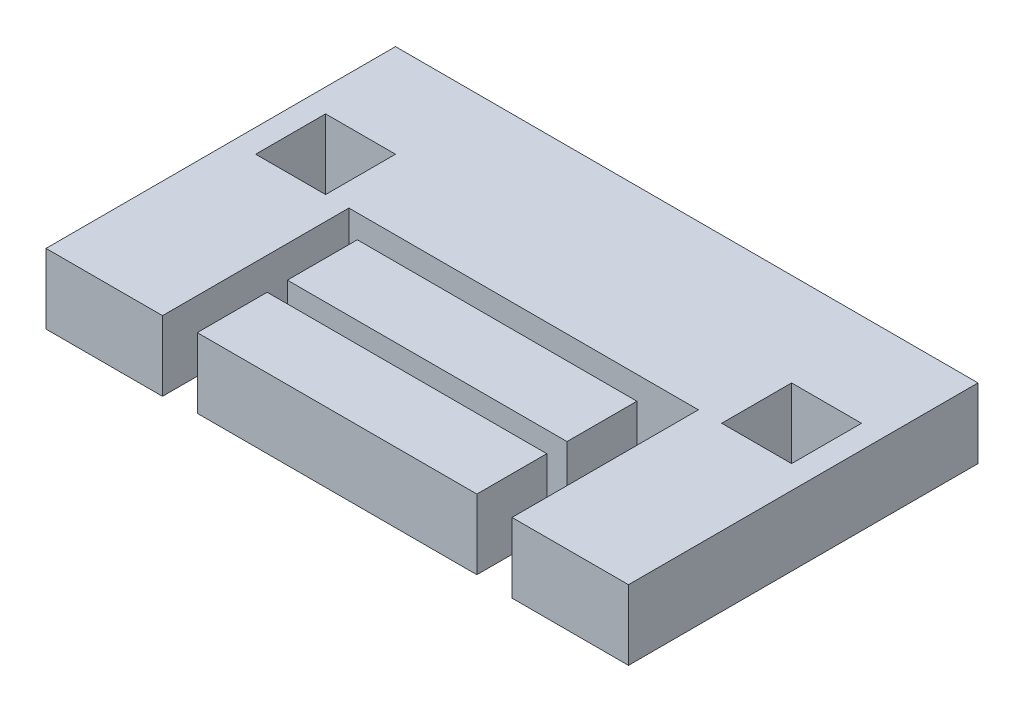
ISO-10303-21;
HEADER;
FILE_DESCRIPTION(('STEP AP214'),'2;1');
FILE_NAME('part.step','',(''),(''),'','','');
FILE_SCHEMA(('AUTOMOTIVE_DESIGN { 1 0 10303 214 1 1 1 1 }'));
ENDSEC;
DATA;
#1=APPLICATION_CONTEXT('core data for automotive mechanical design processes');
#2=APPLICATION_PROTOCOL_DEFINITION('international standard','automotive_design',2000,#1);
#3=PRODUCT_CONTEXT('',#1,'mechanical');
#4=PRODUCT('Part','Part','',(#3));
#5=PRODUCT_RELATED_PRODUCT_CATEGORY('part','',(#4));
#6=PRODUCT_DEFINITION_FORMATION('','',#4);
#7=PRODUCT_DEFINITION_CONTEXT('part definition',#1,'design');
#8=PRODUCT_DEFINITION('design','',#6,#7);
#9=PRODUCT_DEFINITION_SHAPE('','',#8);
#10=(LENGTH_UNIT() NAMED_UNIT(*) SI_UNIT(.MILLI.,.METRE.));
#11=(NAMED_UNIT(*) PLANE_ANGLE_UNIT() SI_UNIT($,.RADIAN.));
#12=(NAMED_UNIT(*) SI_UNIT($,.STERADIAN.) SOLID_ANGLE_UNIT());
#13=UNCERTAINTY_MEASURE_WITH_UNIT(LENGTH_MEASURE(1.E-05),#10,'distance_accuracy_value','');
#14=(GEOMETRIC_REPRESENTATION_CONTEXT(3) GLOBAL_UNCERTAINTY_ASSIGNED_CONTEXT((#13)) GLOBAL_UNIT_ASSIGNED_CONTEXT((#10,
#11,#12)) REPRESENTATION_CONTEXT('',''));
#15=CARTESIAN_POINT('',(0.,0.,0.));
#16=DIRECTION('',(0.,0.,1.));
#17=DIRECTION('',(1.,0.,0.));
#18=AXIS2_PLACEMENT_3D('',#15,#16,#17);
#19=CARTESIAN_POINT('',(-0.427005904587279,3.,0.));
#20=DIRECTION('',(1.,0.,0.));
#21=DIRECTION('',(0.,0.,-1.));
#22=AXIS2_PLACEMENT_3D('',#19,#20,#21);
#23=PLANE('',#22);
#24=DIRECTION('',(0.,0.,1.));
#25=VECTOR('',#24,1.);
#26=CARTESIAN_POINT('',(-0.427005904587279,0.,0.));
#27=LINE('',#26,#25);
#28=CARTESIAN_POINT('',(-0.427005904587279,0.,-7.70715429925636));
#29=VERTEX_POINT('',#28);
#30=CARTESIAN_POINT('',(-0.427005904587279,0.,-4.70715429925636));
#31=VERTEX_POINT('',#30);
#32=EDGE_CURVE('E182',#29,#31,#27,.T.);
#33=ORIENTED_EDGE('',*,*,#32,.F.);
#34=DIRECTION('',(0.,-1.,0.));
#35=VECTOR('',#34,1.);
#36=CARTESIAN_POINT('',(-0.427005904587279,3.,-7.70715429925636));
#37=LINE('',#36,#35);
#38=CARTESIAN_POINT('',(-0.427005904587279,3.,-7.70715429925636));
#39=VERTEX_POINT('',#38);
#40=EDGE_CURVE('E13',#39,#29,#37,.T.);
#41=ORIENTED_EDGE('',*,*,#40,.F.);
#42=DIRECTION('',(0.,0.,1.));
#43=VECTOR('',#42,1.);
#44=CARTESIAN_POINT('',(-0.427005904587279,3.,0.));
#45=LINE('',#44,#43);
#46=CARTESIAN_POINT('',(-0.427005904587279,3.,-4.70715429925636));
#47=VERTEX_POINT('',#46);
#48=EDGE_CURVE('E176',#39,#47,#45,.T.);
#49=ORIENTED_EDGE('',*,*,#48,.T.);
#50=DIRECTION('',(0.,-1.,0.));
#51=VECTOR('',#50,1.);
#52=CARTESIAN_POINT('',(-0.427005904587279,3.,-4.70715429925636));
#53=LINE('',#52,#51);
#54=EDGE_CURVE('E157',#47,#31,#53,.T.);
#55=ORIENTED_EDGE('',*,*,#54,.T.);
#56=EDGE_LOOP('',(#33,#41,#49,#55));
#57=FACE_BOUND('',#56,.T.);
#58=ADVANCED_FACE('F119',(#57),#23,.T.);
#59=CARTESIAN_POINT('',(0.,3.,-7.70715429925636));
#60=DIRECTION('',(0.,0.,-1.));
#61=DIRECTION('',(-1.,0.,0.));
#62=AXIS2_PLACEMENT_3D('',#59,#60,#61);
#63=PLANE('',#62);
#64=DIRECTION('',(1.,0.,0.));
#65=VECTOR('',#64,1.);
#66=CARTESIAN_POINT('',(0.,0.,-7.70715429925636));
#67=LINE('',#66,#65);
#68=CARTESIAN_POINT('',(-12.4270059045873,0.,-7.70715429925636));
#69=VERTEX_POINT('',#68);
#70=EDGE_CURVE('E170',#69,#29,#67,.T.);
#71=ORIENTED_EDGE('',*,*,#70,.F.);
#72=DIRECTION('',(0.,-1.,0.));
#73=VECTOR('',#72,1.);
#74=CARTESIAN_POINT('',(-12.4270059045873,3.,-7.70715429925636));
#75=LINE('',#74,#73);
#76=CARTESIAN_POINT('',(-12.4270059045873,3.,-7.70715429925636));
#77=VERTEX_POINT('',#76);
#78=EDGE_CURVE('E127',#77,#69,#75,.T.);
#79=ORIENTED_EDGE('',*,*,#78,.F.);
#80=DIRECTION('',(1.,0.,0.));
#81=VECTOR('',#80,1.);
#82=CARTESIAN_POINT('',(0.,3.,-7.70715429925636));
#83=LINE('',#82,#81);
#84=EDGE_CURVE('E168',#77,#39,#83,.T.);
#85=ORIENTED_EDGE('',*,*,#84,.T.);
#86=ORIENTED_EDGE('',*,*,#40,.T.);
#87=EDGE_LOOP('',(#71,#79,#85,#86));
#88=FACE_BOUND('',#87,.T.);
#89=ADVANCED_FACE('F166',(#88),#63,.T.);
#90=CARTESIAN_POINT('',(-12.4270059045873,3.,0.));
#91=DIRECTION('',(1.,0.,0.));
#92=DIRECTION('',(0.,0.,-1.));
#93=AXIS2_PLACEMENT_3D('',#90,#91,#92);
#94=PLANE('',#93);
#95=DIRECTION('',(0.,0.,1.));
#96=VECTOR('',#95,1.);
#97=CARTESIAN_POINT('',(-12.4270059045873,0.,0.));
#98=LINE('',#97,#96);
#99=CARTESIAN_POINT('',(-12.4270059045873,0.,-4.70715429925636));
#100=VERTEX_POINT('',#99);
#101=EDGE_CURVE('E150',#69,#100,#98,.T.);
#102=ORIENTED_EDGE('',*,*,#101,.T.);
#103=DIRECTION('',(0.,-1.,0.));
#104=VECTOR('',#103,1.);
#105=CARTESIAN_POINT('',(-12.4270059045873,3.,-4.70715429925636));
#106=LINE('',#105,#104);
#107=CARTESIAN_POINT('',(-12.4270059045873,3.,-4.70715429925636));
#108=VERTEX_POINT('',#107);
#109=EDGE_CURVE('E171',#108,#100,#106,.T.);
#110=ORIENTED_EDGE('',*,*,#109,.F.);
#111=DIRECTION('',(0.,0.,1.));
#112=VECTOR('',#111,1.);
#113=CARTESIAN_POINT('',(-12.4270059045873,3.,0.));
#114=LINE('',#113,#112);
#115=EDGE_CURVE('E172',#77,#108,#114,.T.);
#116=ORIENTED_EDGE('',*,*,#115,.F.);
#117=ORIENTED_EDGE('',*,*,#78,.T.);
#118=EDGE_LOOP('',(#102,#110,#116,#117));
#119=FACE_BOUND('',#118,.T.);
#120=ADVANCED_FACE('F173',(#119),#94,.F.);
#121=CARTESIAN_POINT('',(0.,3.,-4.70715429925636));
#122=DIRECTION('',(0.,0.,-1.));
#123=DIRECTION('',(-1.,0.,0.));
#124=AXIS2_PLACEMENT_3D('',#121,#122,#123);
#125=PLANE('',#124);
#126=DIRECTION('',(1.,0.,0.));
#127=VECTOR('',#126,1.);
#128=CARTESIAN_POINT('',(0.,0.,-4.70715429925636));
#129=LINE('',#128,#127);
#130=EDGE_CURVE('E178',#100,#31,#129,.T.);
#131=ORIENTED_EDGE('',*,*,#130,.T.);
#132=ORIENTED_EDGE('',*,*,#54,.F.);
#133=DIRECTION('',(1.,0.,0.));
#134=VECTOR('',#133,1.);
#135=CARTESIAN_POINT('',(0.,3.,-4.70715429925636));
#136=LINE('',#135,#134);
#137=EDGE_CURVE('E135',#108,#47,#136,.T.);
#138=ORIENTED_EDGE('',*,*,#137,.F.);
#139=ORIENTED_EDGE('',*,*,#109,.T.);
#140=EDGE_LOOP('',(#131,#132,#138,#139));
#141=FACE_BOUND('',#140,.T.);
#142=ADVANCED_FACE('F191',(#141),#125,.F.);
#143=CARTESIAN_POINT('',(0.,3.,0.));
#144=DIRECTION('',(0.,1.,0.));
#145=DIRECTION('',(0.,0.,1.));
#146=AXIS2_PLACEMENT_3D('',#143,#144,#145);
#147=PLANE('',#146);
#148=ORIENTED_EDGE('',*,*,#48,.F.);
#149=ORIENTED_EDGE('',*,*,#84,.F.);
#150=ORIENTED_EDGE('',*,*,#115,.T.);
#151=ORIENTED_EDGE('',*,*,#137,.T.);
#152=EDGE_LOOP('',(#148,#149,#150,#151));
#153=FACE_BOUND('',#152,.T.);
#154=ADVANCED_FACE('F175',(#153),#147,.T.);
#155=CARTESIAN_POINT('',(0.,0.,0.));
#156=DIRECTION('',(0.,1.,0.));
#157=DIRECTION('',(0.,0.,1.));
#158=AXIS2_PLACEMENT_3D('',#155,#156,#157);
#159=PLANE('',#158);
#160=ORIENTED_EDGE('',*,*,#32,.T.);
#161=ORIENTED_EDGE('',*,*,#130,.F.);
#162=ORIENTED_EDGE('',*,*,#101,.F.);
#163=ORIENTED_EDGE('',*,*,#70,.T.);
#164=EDGE_LOOP('',(#160,#161,#162,#163));
#165=FACE_BOUND('',#164,.T.);
#166=ADVANCED_FACE('F193',(#165),#159,.F.);
#167=CLOSED_SHELL('',(#58,#89,#120,#142,#154,#166));
#168=MANIFOLD_SOLID_BREP('B2',#167);
#169=CARTESIAN_POINT('',(-0.443434317864046,3.,0.));
#170=DIRECTION('',(1.,0.,0.));
#171=DIRECTION('',(0.,0.,-1.));
#172=AXIS2_PLACEMENT_3D('',#169,#170,#171);
#173=PLANE('',#172);
#174=DIRECTION('',(0.,0.,1.));
#175=VECTOR('',#174,1.);
#176=CARTESIAN_POINT('',(-0.443434317864046,0.,0.));
#177=LINE('',#176,#175);
#178=CARTESIAN_POINT('',(-0.443434317864047,0.,-11.5917753515357));
#179=VERTEX_POINT('',#178);
#180=CARTESIAN_POINT('',(-0.443434317864047,0.,-8.59177535153571));
#181=VERTEX_POINT('',#180);
#182=EDGE_CURVE('E314',#179,#181,#177,.T.);
#183=ORIENTED_EDGE('',*,*,#182,.F.);
#184=DIRECTION('',(0.,-1.,0.));
#185=VECTOR('',#184,1.);
#186=CARTESIAN_POINT('',(-0.443434317864047,3.,-11.5917753515357));
#187=LINE('',#186,#185);
#188=CARTESIAN_POINT('',(-0.443434317864047,3.,-11.5917753515357));
#189=VERTEX_POINT('',#188);
#190=EDGE_CURVE('E117',#189,#179,#187,.T.);
#191=ORIENTED_EDGE('',*,*,#190,.F.);
#192=DIRECTION('',(0.,0.,1.));
#193=VECTOR('',#192,1.);
#194=CARTESIAN_POINT('',(-0.443434317864046,3.,0.));
#195=LINE('',#194,#193);
#196=CARTESIAN_POINT('',(-0.443434317864047,3.,-8.59177535153571));
#197=VERTEX_POINT('',#196);
#198=EDGE_CURVE('E308',#189,#197,#195,.T.);
#199=ORIENTED_EDGE('',*,*,#198,.T.);
#200=DIRECTION('',(0.,-1.,0.));
#201=VECTOR('',#200,1.);
#202=CARTESIAN_POINT('',(-0.443434317864047,3.,-8.59177535153571));
#203=LINE('',#202,#201);
#204=EDGE_CURVE('E289',#197,#181,#203,.T.);
#205=ORIENTED_EDGE('',*,*,#204,.T.);
#206=EDGE_LOOP('',(#183,#191,#199,#205));
#207=FACE_BOUND('',#206,.T.);
#208=ADVANCED_FACE('F251',(#207),#173,.T.);
#209=CARTESIAN_POINT('',(0.,3.,-11.5917753515357));
#210=DIRECTION('',(0.,0.,-1.));
#211=DIRECTION('',(-1.,0.,0.));
#212=AXIS2_PLACEMENT_3D('',#209,#210,#211);
#213=PLANE('',#212);
#214=DIRECTION('',(1.,0.,0.));
#215=VECTOR('',#214,1.);
#216=CARTESIAN_POINT('',(0.,0.,-11.5917753515357));
#217=LINE('',#216,#215);
#218=CARTESIAN_POINT('',(-12.443434317864,0.,-11.5917753515357));
#219=VERTEX_POINT('',#218);
#220=EDGE_CURVE('E302',#219,#179,#217,.T.);
#221=ORIENTED_EDGE('',*,*,#220,.F.);
#222=DIRECTION('',(0.,-1.,0.));
#223=VECTOR('',#222,1.);
#224=CARTESIAN_POINT('',(-12.443434317864,3.,-11.5917753515357));
#225=LINE('',#224,#223);
#226=CARTESIAN_POINT('',(-12.443434317864,3.,-11.5917753515357));
#227=VERTEX_POINT('',#226);
#228=EDGE_CURVE('E259',#227,#219,#225,.T.);
#229=ORIENTED_EDGE('',*,*,#228,.F.);
#230=DIRECTION('',(1.,0.,0.));
#231=VECTOR('',#230,1.);
#232=CARTESIAN_POINT('',(0.,3.,-11.5917753515357));
#233=LINE('',#232,#231);
#234=EDGE_CURVE('E300',#227,#189,#233,.T.);
#235=ORIENTED_EDGE('',*,*,#234,.T.);
#236=ORIENTED_EDGE('',*,*,#190,.T.);
#237=EDGE_LOOP('',(#221,#229,#235,#236));
#238=FACE_BOUND('',#237,.T.);
#239=ADVANCED_FACE('F298',(#238),#213,.T.);
#240=CARTESIAN_POINT('',(-12.443434317864,3.,0.));
#241=DIRECTION('',(1.,0.,0.));
#242=DIRECTION('',(0.,0.,-1.));
#243=AXIS2_PLACEMENT_3D('',#240,#241,#242);
#244=PLANE('',#243);
#245=DIRECTION('',(0.,0.,1.));
#246=VECTOR('',#245,1.);
#247=CARTESIAN_POINT('',(-12.443434317864,0.,0.));
#248=LINE('',#247,#246);
#249=CARTESIAN_POINT('',(-12.443434317864,0.,-8.59177535153571));
#250=VERTEX_POINT('',#249);
#251=EDGE_CURVE('E282',#219,#250,#248,.T.);
#252=ORIENTED_EDGE('',*,*,#251,.T.);
#253=DIRECTION('',(0.,-1.,0.));
#254=VECTOR('',#253,1.);
#255=CARTESIAN_POINT('',(-12.443434317864,3.,-8.59177535153571));
#256=LINE('',#255,#254);
#257=CARTESIAN_POINT('',(-12.443434317864,3.,-8.59177535153571));
#258=VERTEX_POINT('',#257);
#259=EDGE_CURVE('E303',#258,#250,#256,.T.);
#260=ORIENTED_EDGE('',*,*,#259,.F.);
#261=DIRECTION('',(0.,0.,1.));
#262=VECTOR('',#261,1.);
#263=CARTESIAN_POINT('',(-12.443434317864,3.,0.));
#264=LINE('',#263,#262);
#265=EDGE_CURVE('E304',#227,#258,#264,.T.);
#266=ORIENTED_EDGE('',*,*,#265,.F.);
#267=ORIENTED_EDGE('',*,*,#228,.T.);
#268=EDGE_LOOP('',(#252,#260,#266,#267));
#269=FACE_BOUND('',#268,.T.);
#270=ADVANCED_FACE('F305',(#269),#244,.F.);
#271=CARTESIAN_POINT('',(0.,3.,-8.59177535153571));
#272=DIRECTION('',(0.,0.,-1.));
#273=DIRECTION('',(-1.,0.,0.));
#274=AXIS2_PLACEMENT_3D('',#271,#272,#273);
#275=PLANE('',#274);
#276=DIRECTION('',(1.,0.,0.));
#277=VECTOR('',#276,1.);
#278=CARTESIAN_POINT('',(0.,0.,-8.59177535153571));
#279=LINE('',#278,#277);
#280=EDGE_CURVE('E310',#250,#181,#279,.T.);
#281=ORIENTED_EDGE('',*,*,#280,.T.);
#282=ORIENTED_EDGE('',*,*,#204,.F.);
#283=DIRECTION('',(1.,0.,0.));
#284=VECTOR('',#283,1.);
#285=CARTESIAN_POINT('',(0.,3.,-8.59177535153571));
#286=LINE('',#285,#284);
#287=EDGE_CURVE('E267',#258,#197,#286,.T.);
#288=ORIENTED_EDGE('',*,*,#287,.F.);
#289=ORIENTED_EDGE('',*,*,#259,.T.);
#290=EDGE_LOOP('',(#281,#282,#288,#289));
#291=FACE_BOUND('',#290,.T.);
#292=ADVANCED_FACE('F323',(#291),#275,.F.);
#293=CARTESIAN_POINT('',(0.,3.,0.));
#294=DIRECTION('',(0.,1.,0.));
#295=DIRECTION('',(0.,0.,1.));
#296=AXIS2_PLACEMENT_3D('',#293,#294,#295);
#297=PLANE('',#296);
#298=ORIENTED_EDGE('',*,*,#198,.F.);
#299=ORIENTED_EDGE('',*,*,#234,.F.);
#300=ORIENTED_EDGE('',*,*,#265,.T.);
#301=ORIENTED_EDGE('',*,*,#287,.T.);
#302=EDGE_LOOP('',(#298,#299,#300,#301));
#303=FACE_BOUND('',#302,.T.);
#304=ADVANCED_FACE('F307',(#303),#297,.T.);
#305=CARTESIAN_POINT('',(0.,0.,0.));
#306=DIRECTION('',(0.,1.,0.));
#307=DIRECTION('',(0.,0.,1.));
#308=AXIS2_PLACEMENT_3D('',#305,#306,#307);
#309=PLANE('',#308);
#310=ORIENTED_EDGE('',*,*,#182,.T.);
#311=ORIENTED_EDGE('',*,*,#280,.F.);
#312=ORIENTED_EDGE('',*,*,#251,.F.);
#313=ORIENTED_EDGE('',*,*,#220,.T.);
#314=EDGE_LOOP('',(#310,#311,#312,#313));
#315=FACE_BOUND('',#314,.T.);
#316=ADVANCED_FACE('F325',(#315),#309,.F.);
#317=CLOSED_SHELL('',(#208,#239,#270,#292,#304,#316));
#318=MANIFOLD_SOLID_BREP('B7',#317);
#319=CARTESIAN_POINT('',(0.,3.,-15.5917753515357));
#320=DIRECTION('',(0.,0.,1.));
#321=DIRECTION('',(1.,0.,0.));
#322=AXIS2_PLACEMENT_3D('',#319,#320,#321);
#323=PLANE('',#322);
#324=DIRECTION('',(-1.,0.,0.));
#325=VECTOR('',#324,1.);
#326=CARTESIAN_POINT('',(0.,0.,-15.5917753515357));
#327=LINE('',#326,#325);
#328=CARTESIAN_POINT('',(5.19620285318212,0.,-15.5917753515357));
#329=VERTEX_POINT('',#328);
#330=CARTESIAN_POINT('',(2.19620285318211,0.,-15.5917753515357));
#331=VERTEX_POINT('',#330);
#332=EDGE_CURVE('E588',#329,#331,#327,.T.);
#333=ORIENTED_EDGE('',*,*,#332,.F.);
#334=DIRECTION('',(0.,-1.,0.));
#335=VECTOR('',#334,1.);
#336=CARTESIAN_POINT('',(5.19620285318212,3.,-15.5917753515357));
#337=LINE('',#336,#335);
#338=CARTESIAN_POINT('',(5.19620285318212,3.,-15.5917753515357));
#339=VERTEX_POINT('',#338);
#340=EDGE_CURVE('E249',#339,#329,#337,.T.);
#341=ORIENTED_EDGE('',*,*,#340,.F.);
#342=DIRECTION('',(-1.,0.,0.));
#343=VECTOR('',#342,1.);
#344=CARTESIAN_POINT('',(0.,3.,-15.5917753515357));
#345=LINE('',#344,#343);
#346=CARTESIAN_POINT('',(2.19620285318211,3.,-15.5917753515357));
#347=VERTEX_POINT('',#346);
#348=EDGE_CURVE('E508',#339,#347,#345,.T.);
#349=ORIENTED_EDGE('',*,*,#348,.T.);
#350=DIRECTION('',(0.,-1.,0.));
#351=VECTOR('',#350,1.);
#352=CARTESIAN_POINT('',(2.19620285318211,3.,-15.5917753515357));
#353=LINE('',#352,#351);
#354=EDGE_CURVE('E393',#347,#331,#353,.T.);
#355=ORIENTED_EDGE('',*,*,#354,.T.);
#356=EDGE_LOOP('',(#333,#341,#349,#355));
#357=FACE_BOUND('',#356,.T.);
#358=ADVANCED_FACE('F374',(#357),#323,.T.);
#359=CARTESIAN_POINT('',(5.1962028531821,3.,0.));
#360=DIRECTION('',(1.,0.,0.));
#361=DIRECTION('',(0.,0.,-1.));
#362=AXIS2_PLACEMENT_3D('',#359,#360,#361);
#363=PLANE('',#362);
#364=DIRECTION('',(0.,0.,1.));
#365=VECTOR('',#364,1.);
#366=CARTESIAN_POINT('',(5.1962028531821,0.,0.));
#367=LINE('',#366,#365);
#368=CARTESIAN_POINT('',(5.19620285318211,0.,-12.5917753515357));
#369=VERTEX_POINT('',#368);
#370=EDGE_CURVE('E513',#329,#369,#367,.T.);
#371=ORIENTED_EDGE('',*,*,#370,.T.);
#372=DIRECTION('',(0.,-1.,0.));
#373=VECTOR('',#372,1.);
#374=CARTESIAN_POINT('',(5.19620285318211,3.,-12.5917753515357));
#375=LINE('',#374,#373);
#376=CARTESIAN_POINT('',(5.19620285318211,3.,-12.5917753515357));
#377=VERTEX_POINT('',#376);
#378=EDGE_CURVE('E384',#377,#369,#375,.T.);
#379=ORIENTED_EDGE('',*,*,#378,.F.);
#380=DIRECTION('',(0.,0.,1.));
#381=VECTOR('',#380,1.);
#382=CARTESIAN_POINT('',(5.1962028531821,3.,0.));
#383=LINE('',#382,#381);
#384=EDGE_CURVE('E503',#339,#377,#383,.T.);
#385=ORIENTED_EDGE('',*,*,#384,.F.);
#386=ORIENTED_EDGE('',*,*,#340,.T.);
#387=EDGE_LOOP('',(#371,#379,#385,#386));
#388=FACE_BOUND('',#387,.T.);
#389=ADVANCED_FACE('F511',(#388),#363,.F.);
#390=CARTESIAN_POINT('',(0.,3.,-12.5917753515357));
#391=DIRECTION('',(0.,0.,1.));
#392=DIRECTION('',(1.,0.,0.));
#393=AXIS2_PLACEMENT_3D('',#390,#391,#392);
#394=PLANE('',#393);
#395=DIRECTION('',(-1.,0.,0.));
#396=VECTOR('',#395,1.);
#397=CARTESIAN_POINT('',(0.,0.,-12.5917753515357));
#398=LINE('',#397,#396);
#399=CARTESIAN_POINT('',(2.19620285318211,0.,-12.5917753515357));
#400=VERTEX_POINT('',#399);
#401=EDGE_CURVE('E591',#369,#400,#398,.T.);
#402=ORIENTED_EDGE('',*,*,#401,.T.);
#403=DIRECTION('',(0.,-1.,0.));
#404=VECTOR('',#403,1.);
#405=CARTESIAN_POINT('',(2.19620285318211,3.,-12.5917753515357));
#406=LINE('',#405,#404);
#407=CARTESIAN_POINT('',(2.19620285318211,3.,-12.5917753515357));
#408=VERTEX_POINT('',#407);
#409=EDGE_CURVE('E443',#408,#400,#406,.T.);
#410=ORIENTED_EDGE('',*,*,#409,.F.);
#411=DIRECTION('',(-1.,0.,0.));
#412=VECTOR('',#411,1.);
#413=CARTESIAN_POINT('',(0.,3.,-12.5917753515357));
#414=LINE('',#413,#412);
#415=EDGE_CURVE('E495',#377,#408,#414,.T.);
#416=ORIENTED_EDGE('',*,*,#415,.F.);
#417=ORIENTED_EDGE('',*,*,#378,.T.);
#418=EDGE_LOOP('',(#402,#410,#416,#417));
#419=FACE_BOUND('',#418,.T.);
#420=ADVANCED_FACE('F497',(#419),#394,.F.);
#421=CARTESIAN_POINT('',(0.,3.,-15.5917753515357));
#422=DIRECTION('',(0.,0.,-1.));
#423=DIRECTION('',(-1.,0.,0.));
#424=AXIS2_PLACEMENT_3D('',#421,#422,#423);
#425=PLANE('',#424);
#426=DIRECTION('',(1.,0.,0.));
#427=VECTOR('',#426,1.);
#428=CARTESIAN_POINT('',(0.,0.,-15.5917753515357));
#429=LINE('',#428,#427);
#430=CARTESIAN_POINT('',(-17.8037971468179,0.,-15.5917753515357));
#431=VERTEX_POINT('',#430);
#432=CARTESIAN_POINT('',(-14.8037971468179,0.,-15.5917753515357));
#433=VERTEX_POINT('',#432);
#434=EDGE_CURVE('E576',#431,#433,#429,.T.);
#435=ORIENTED_EDGE('',*,*,#434,.T.);
#436=DIRECTION('',(0.,-1.,0.));
#437=VECTOR('',#436,1.);
#438=CARTESIAN_POINT('',(-14.8037971468179,3.,-15.5917753515357));
#439=LINE('',#438,#437);
#440=CARTESIAN_POINT('',(-14.8037971468179,3.,-15.5917753515357));
#441=VERTEX_POINT('',#440);
#442=EDGE_CURVE('E524',#441,#433,#439,.T.);
#443=ORIENTED_EDGE('',*,*,#442,.F.);
#444=DIRECTION('',(1.,0.,0.));
#445=VECTOR('',#444,1.);
#446=CARTESIAN_POINT('',(0.,3.,-15.5917753515357));
#447=LINE('',#446,#445);
#448=CARTESIAN_POINT('',(-17.8037971468179,3.,-15.5917753515357));
#449=VERTEX_POINT('',#448);
#450=EDGE_CURVE('E614',#449,#441,#447,.T.);
#451=ORIENTED_EDGE('',*,*,#450,.F.);
#452=DIRECTION('',(0.,-1.,0.));
#453=VECTOR('',#452,1.);
#454=CARTESIAN_POINT('',(-17.8037971468179,3.,-15.5917753515357));
#455=LINE('',#454,#453);
#456=EDGE_CURVE('E518',#449,#431,#455,.T.);
#457=ORIENTED_EDGE('',*,*,#456,.T.);
#458=EDGE_LOOP('',(#435,#443,#451,#457));
#459=FACE_BOUND('',#458,.T.);
#460=ADVANCED_FACE('F658',(#459),#425,.F.);
#461=CARTESIAN_POINT('',(-14.8037971468179,3.,0.));
#462=DIRECTION('',(1.,0.,0.));
#463=DIRECTION('',(0.,0.,-1.));
#464=AXIS2_PLACEMENT_3D('',#461,#462,#463);
#465=PLANE('',#464);
#466=DIRECTION('',(0.,0.,1.));
#467=VECTOR('',#466,1.);
#468=CARTESIAN_POINT('',(-14.8037971468179,0.,0.));
#469=LINE('',#468,#467);
#470=CARTESIAN_POINT('',(-14.8037971468179,0.,-12.5917753515357));
#471=VERTEX_POINT('',#470);
#472=EDGE_CURVE('E579',#433,#471,#469,.T.);
#473=ORIENTED_EDGE('',*,*,#472,.T.);
#474=DIRECTION('',(0.,-1.,0.));
#475=VECTOR('',#474,1.);
#476=CARTESIAN_POINT('',(-14.8037971468179,3.,-12.5917753515357));
#477=LINE('',#476,#475);
#478=CARTESIAN_POINT('',(-14.8037971468179,3.,-12.5917753515357));
#479=VERTEX_POINT('',#478);
#480=EDGE_CURVE('E522',#479,#471,#477,.T.);
#481=ORIENTED_EDGE('',*,*,#480,.F.);
#482=DIRECTION('',(0.,0.,1.));
#483=VECTOR('',#482,1.);
#484=CARTESIAN_POINT('',(-14.8037971468179,3.,0.));
#485=LINE('',#484,#483);
#486=EDGE_CURVE('E617',#441,#479,#485,.T.);
#487=ORIENTED_EDGE('',*,*,#486,.F.);
#488=ORIENTED_EDGE('',*,*,#442,.T.);
#489=EDGE_LOOP('',(#473,#481,#487,#488));
#490=FACE_BOUND('',#489,.T.);
#491=ADVANCED_FACE('F654',(#490),#465,.F.);
#492=CARTESIAN_POINT('',(0.,3.,-12.5917753515357));
#493=DIRECTION('',(0.,0.,-1.));
#494=DIRECTION('',(-1.,0.,0.));
#495=AXIS2_PLACEMENT_3D('',#492,#493,#494);
#496=PLANE('',#495);
#497=DIRECTION('',(1.,0.,0.));
#498=VECTOR('',#497,1.);
#499=CARTESIAN_POINT('',(0.,0.,-12.5917753515357));
#500=LINE('',#499,#498);
#501=CARTESIAN_POINT('',(-17.8037971468179,0.,-12.5917753515357));
#502=VERTEX_POINT('',#501);
#503=EDGE_CURVE('E582',#502,#471,#500,.T.);
#504=ORIENTED_EDGE('',*,*,#503,.F.);
#505=DIRECTION('',(0.,-1.,0.));
#506=VECTOR('',#505,1.);
#507=CARTESIAN_POINT('',(-17.8037971468179,3.,-12.5917753515357));
#508=LINE('',#507,#506);
#509=CARTESIAN_POINT('',(-17.8037971468179,3.,-12.5917753515357));
#510=VERTEX_POINT('',#509);
#511=EDGE_CURVE('E520',#510,#502,#508,.T.);
#512=ORIENTED_EDGE('',*,*,#511,.F.);
#513=DIRECTION('',(1.,0.,0.));
#514=VECTOR('',#513,1.);
#515=CARTESIAN_POINT('',(0.,3.,-12.5917753515357));
#516=LINE('',#515,#514);
#517=EDGE_CURVE('E619',#510,#479,#516,.T.);
#518=ORIENTED_EDGE('',*,*,#517,.T.);
#519=ORIENTED_EDGE('',*,*,#480,.T.);
#520=EDGE_LOOP('',(#504,#512,#518,#519));
#521=FACE_BOUND('',#520,.T.);
#522=ADVANCED_FACE('F651',(#521),#496,.T.);
#523=CARTESIAN_POINT('',(0.,3.,-12.5917753515357));
#524=DIRECTION('',(0.,0.,-1.));
#525=DIRECTION('',(-1.,0.,0.));
#526=AXIS2_PLACEMENT_3D('',#523,#524,#525);
#527=PLANE('',#526);
#528=DIRECTION('',(1.,0.,0.));
#529=VECTOR('',#528,1.);
#530=CARTESIAN_POINT('',(0.,0.,-12.5917753515357));
#531=LINE('',#530,#529);
#532=CARTESIAN_POINT('',(-13.8037971468179,0.,-12.5917753515357));
#533=VERTEX_POINT('',#532);
#534=CARTESIAN_POINT('',(1.19620285318211,0.,-12.5917753515357));
#535=VERTEX_POINT('',#534);
#536=EDGE_CURVE('E554',#533,#535,#531,.T.);
#537=ORIENTED_EDGE('',*,*,#536,.T.);
#538=DIRECTION('',(0.,-1.,0.));
#539=VECTOR('',#538,1.);
#540=CARTESIAN_POINT('',(1.19620285318211,3.,-12.5917753515357));
#541=LINE('',#540,#539);
#542=CARTESIAN_POINT('',(1.19620285318211,3.,-12.5917753515357));
#543=VERTEX_POINT('',#542);
#544=EDGE_CURVE('E378',#543,#535,#541,.T.);
#545=ORIENTED_EDGE('',*,*,#544,.F.);
#546=DIRECTION('',(1.,0.,0.));
#547=VECTOR('',#546,1.);
#548=CARTESIAN_POINT('',(0.,3.,-12.5917753515357));
#549=LINE('',#548,#547);
#550=CARTESIAN_POINT('',(-13.8037971468179,3.,-12.5917753515357));
#551=VERTEX_POINT('',#550);
#552=EDGE_CURVE('E595',#551,#543,#549,.T.);
#553=ORIENTED_EDGE('',*,*,#552,.F.);
#554=DIRECTION('',(0.,-1.,0.));
#555=VECTOR('',#554,1.);
#556=CARTESIAN_POINT('',(-13.8037971468179,3.,-12.5917753515357));
#557=LINE('',#556,#555);
#558=EDGE_CURVE('E527',#551,#533,#557,.T.);
#559=ORIENTED_EDGE('',*,*,#558,.T.);
#560=EDGE_LOOP('',(#537,#545,#553,#559));
#561=FACE_BOUND('',#560,.T.);
#562=ADVANCED_FACE('F376',(#561),#527,.F.);
#563=CARTESIAN_POINT('',(1.19620285318212,3.,0.));
#564=DIRECTION('',(1.,0.,0.));
#565=DIRECTION('',(0.,0.,-1.));
#566=AXIS2_PLACEMENT_3D('',#563,#564,#565);
#567=PLANE('',#566);
#568=DIRECTION('',(0.,0.,1.));
#569=VECTOR('',#568,1.);
#570=CARTESIAN_POINT('',(1.19620285318212,0.,0.));
#571=LINE('',#570,#569);
#572=CARTESIAN_POINT('',(1.19620285318212,0.,-4.59177535153571));
#573=VERTEX_POINT('',#572);
#574=EDGE_CURVE('E550',#535,#573,#571,.T.);
#575=ORIENTED_EDGE('',*,*,#574,.T.);
#576=DIRECTION('',(0.,-1.,0.));
#577=VECTOR('',#576,1.);
#578=CARTESIAN_POINT('',(1.19620285318212,3.,-4.59177535153571));
#579=LINE('',#578,#577);
#580=CARTESIAN_POINT('',(1.19620285318212,3.,-4.59177535153571));
#581=VERTEX_POINT('',#580);
#582=EDGE_CURVE('E542',#581,#573,#579,.T.);
#583=ORIENTED_EDGE('',*,*,#582,.F.);
#584=DIRECTION('',(0.,0.,1.));
#585=VECTOR('',#584,1.);
#586=CARTESIAN_POINT('',(1.19620285318212,3.,0.));
#587=LINE('',#586,#585);
#588=EDGE_CURVE('E456',#543,#581,#587,.T.);
#589=ORIENTED_EDGE('',*,*,#588,.F.);
#590=ORIENTED_EDGE('',*,*,#544,.T.);
#591=EDGE_LOOP('',(#575,#583,#589,#590));
#592=FACE_BOUND('',#591,.T.);
#593=ADVANCED_FACE('F549',(#592),#567,.F.);
#594=CARTESIAN_POINT('',(0.,3.,-4.59177535153571));
#595=DIRECTION('',(0.,0.,-1.));
#596=DIRECTION('',(-1.,0.,0.));
#597=AXIS2_PLACEMENT_3D('',#594,#595,#596);
#598=PLANE('',#597);
#599=DIRECTION('',(1.,0.,0.));
#600=VECTOR('',#599,1.);
#601=CARTESIAN_POINT('',(0.,0.,-4.59177535153571));
#602=LINE('',#601,#600);
#603=CARTESIAN_POINT('',(6.19620285318211,0.,-4.59177535153571));
#604=VERTEX_POINT('',#603);
#605=EDGE_CURVE('E559',#573,#604,#602,.T.);
#606=ORIENTED_EDGE('',*,*,#605,.T.);
#607=DIRECTION('',(0.,-1.,0.));
#608=VECTOR('',#607,1.);
#609=CARTESIAN_POINT('',(6.19620285318211,3.,-4.59177535153571));
#610=LINE('',#609,#608);
#611=CARTESIAN_POINT('',(6.19620285318211,3.,-4.59177535153571));
#612=VERTEX_POINT('',#611);
#613=EDGE_CURVE('E540',#612,#604,#610,.T.);
#614=ORIENTED_EDGE('',*,*,#613,.F.);
#615=DIRECTION('',(1.,0.,0.));
#616=VECTOR('',#615,1.);
#617=CARTESIAN_POINT('',(0.,3.,-4.59177535153571));
#618=LINE('',#617,#616);
#619=EDGE_CURVE('E599',#581,#612,#618,.T.);
#620=ORIENTED_EDGE('',*,*,#619,.F.);
#621=ORIENTED_EDGE('',*,*,#582,.T.);
#622=EDGE_LOOP('',(#606,#614,#620,#621));
#623=FACE_BOUND('',#622,.T.);
#624=ADVANCED_FACE('F677',(#623),#598,.F.);
#625=CARTESIAN_POINT('',(6.19620285318211,3.,0.));
#626=DIRECTION('',(-1.,0.,0.));
#627=DIRECTION('',(0.,0.,1.));
#628=AXIS2_PLACEMENT_3D('',#625,#626,#627);
#629=PLANE('',#628);
#630=DIRECTION('',(0.,0.,-1.));
#631=VECTOR('',#630,1.);
#632=CARTESIAN_POINT('',(6.19620285318211,0.,0.));
#633=LINE('',#632,#631);
#634=CARTESIAN_POINT('',(6.19620285318212,0.,-19.5917753515357));
#635=VERTEX_POINT('',#634);
#636=EDGE_CURVE('E564',#604,#635,#633,.T.);
#637=ORIENTED_EDGE('',*,*,#636,.T.);
#638=DIRECTION('',(0.,-1.,0.));
#639=VECTOR('',#638,1.);
#640=CARTESIAN_POINT('',(6.19620285318212,3.,-19.5917753515357));
#641=LINE('',#640,#639);
#642=CARTESIAN_POINT('',(6.19620285318212,3.,-19.5917753515357));
#643=VERTEX_POINT('',#642);
#644=EDGE_CURVE('E538',#643,#635,#641,.T.);
#645=ORIENTED_EDGE('',*,*,#644,.F.);
#646=DIRECTION('',(0.,0.,-1.));
#647=VECTOR('',#646,1.);
#648=CARTESIAN_POINT('',(6.19620285318211,3.,0.));
#649=LINE('',#648,#647);
#650=EDGE_CURVE('E603',#612,#643,#649,.T.);
#651=ORIENTED_EDGE('',*,*,#650,.F.);
#652=ORIENTED_EDGE('',*,*,#613,.T.);
#653=EDGE_LOOP('',(#637,#645,#651,#652));
#654=FACE_BOUND('',#653,.T.);
#655=ADVANCED_FACE('F673',(#654),#629,.F.);
#656=CARTESIAN_POINT('',(0.,3.,-19.5917753515357));
#657=DIRECTION('',(0.,0.,-1.));
#658=DIRECTION('',(-1.,0.,0.));
#659=AXIS2_PLACEMENT_3D('',#656,#657,#658);
#660=PLANE('',#659);
#661=DIRECTION('',(1.,0.,0.));
#662=VECTOR('',#661,1.);
#663=CARTESIAN_POINT('',(0.,0.,-19.5917753515357));
#664=LINE('',#663,#662);
#665=CARTESIAN_POINT('',(-18.8037971468179,0.,-19.5917753515357));
#666=VERTEX_POINT('',#665);
#667=EDGE_CURVE('E567',#666,#635,#664,.T.);
#668=ORIENTED_EDGE('',*,*,#667,.F.);
#669=DIRECTION('',(0.,-1.,0.));
#670=VECTOR('',#669,1.);
#671=CARTESIAN_POINT('',(-18.8037971468179,3.,-19.5917753515357));
#672=LINE('',#671,#670);
#673=CARTESIAN_POINT('',(-18.8037971468179,3.,-19.5917753515357));
#674=VERTEX_POINT('',#673);
#675=EDGE_CURVE('E536',#674,#666,#672,.T.);
#676=ORIENTED_EDGE('',*,*,#675,.F.);
#677=DIRECTION('',(1.,0.,0.));
#678=VECTOR('',#677,1.);
#679=CARTESIAN_POINT('',(0.,3.,-19.5917753515357));
#680=LINE('',#679,#678);
#681=EDGE_CURVE('E605',#674,#643,#680,.T.);
#682=ORIENTED_EDGE('',*,*,#681,.T.);
#683=ORIENTED_EDGE('',*,*,#644,.T.);
#684=EDGE_LOOP('',(#668,#676,#682,#683));
#685=FACE_BOUND('',#684,.T.);
#686=ADVANCED_FACE('F669',(#685),#660,.T.);
#687=CARTESIAN_POINT('',(-18.8037971468179,3.,0.));
#688=DIRECTION('',(1.,0.,0.));
#689=DIRECTION('',(0.,0.,-1.));
#690=AXIS2_PLACEMENT_3D('',#687,#688,#689);
#691=PLANE('',#690);
#692=DIRECTION('',(0.,0.,1.));
#693=VECTOR('',#692,1.);
#694=CARTESIAN_POINT('',(-18.8037971468179,0.,0.));
#695=LINE('',#694,#693);
#696=CARTESIAN_POINT('',(-18.8037971468179,0.,-4.59177535153571));
#697=VERTEX_POINT('',#696);
#698=EDGE_CURVE('E570',#666,#697,#695,.T.);
#699=ORIENTED_EDGE('',*,*,#698,.T.);
#700=DIRECTION('',(0.,-1.,0.));
#701=VECTOR('',#700,1.);
#702=CARTESIAN_POINT('',(-18.8037971468179,3.,-4.59177535153571));
#703=LINE('',#702,#701);
#704=CARTESIAN_POINT('',(-18.8037971468179,3.,-4.59177535153571));
#705=VERTEX_POINT('',#704);
#706=EDGE_CURVE('E533',#705,#697,#703,.T.);
#707=ORIENTED_EDGE('',*,*,#706,.F.);
#708=DIRECTION('',(0.,0.,1.));
#709=VECTOR('',#708,1.);
#710=CARTESIAN_POINT('',(-18.8037971468179,3.,0.));
#711=LINE('',#710,#709);
#712=EDGE_CURVE('E608',#674,#705,#711,.T.);
#713=ORIENTED_EDGE('',*,*,#712,.F.);
#714=ORIENTED_EDGE('',*,*,#675,.T.);
#715=EDGE_LOOP('',(#699,#707,#713,#714));
#716=FACE_BOUND('',#715,.T.);
#717=ADVANCED_FACE('F665',(#716),#691,.F.);
#718=CARTESIAN_POINT('',(0.,3.,-4.59177535153571));
#719=DIRECTION('',(0.,0.,-1.));
#720=DIRECTION('',(-1.,0.,0.));
#721=AXIS2_PLACEMENT_3D('',#718,#719,#720);
#722=PLANE('',#721);
#723=DIRECTION('',(1.,0.,0.));
#724=VECTOR('',#723,1.);
#725=CARTESIAN_POINT('',(0.,0.,-4.59177535153571));
#726=LINE('',#725,#724);
#727=CARTESIAN_POINT('',(-13.8037971468179,0.,-4.59177535153571));
#728=VERTEX_POINT('',#727);
#729=EDGE_CURVE('E572',#697,#728,#726,.T.);
#730=ORIENTED_EDGE('',*,*,#729,.T.);
#731=DIRECTION('',(0.,-1.,0.));
#732=VECTOR('',#731,1.);
#733=CARTESIAN_POINT('',(-13.8037971468179,3.,-4.59177535153571));
#734=LINE('',#733,#732);
#735=CARTESIAN_POINT('',(-13.8037971468179,3.,-4.59177535153571));
#736=VERTEX_POINT('',#735);
#737=EDGE_CURVE('E530',#736,#728,#734,.T.);
#738=ORIENTED_EDGE('',*,*,#737,.F.);
#739=DIRECTION('',(1.,0.,0.));
#740=VECTOR('',#739,1.);
#741=CARTESIAN_POINT('',(0.,3.,-4.59177535153571));
#742=LINE('',#741,#740);
#743=EDGE_CURVE('E610',#705,#736,#742,.T.);
#744=ORIENTED_EDGE('',*,*,#743,.F.);
#745=ORIENTED_EDGE('',*,*,#706,.T.);
#746=EDGE_LOOP('',(#730,#738,#744,#745));
#747=FACE_BOUND('',#746,.T.);
#748=ADVANCED_FACE('F649',(#747),#722,.F.);
#749=CARTESIAN_POINT('',(-17.8037971468179,3.,0.));
#750=DIRECTION('',(1.,0.,0.));
#751=DIRECTION('',(0.,0.,-1.));
#752=AXIS2_PLACEMENT_3D('',#749,#750,#751);
#753=PLANE('',#752);
#754=DIRECTION('',(0.,0.,1.));
#755=VECTOR('',#754,1.);
#756=CARTESIAN_POINT('',(-17.8037971468179,0.,0.));
#757=LINE('',#756,#755);
#758=EDGE_CURVE('E585',#431,#502,#757,.T.);
#759=ORIENTED_EDGE('',*,*,#758,.F.);
#760=ORIENTED_EDGE('',*,*,#456,.F.);
#761=DIRECTION('',(0.,0.,1.));
#762=VECTOR('',#761,1.);
#763=CARTESIAN_POINT('',(-17.8037971468179,3.,0.));
#764=LINE('',#763,#762);
#765=EDGE_CURVE('E622',#449,#510,#764,.T.);
#766=ORIENTED_EDGE('',*,*,#765,.T.);
#767=ORIENTED_EDGE('',*,*,#511,.T.);
#768=EDGE_LOOP('',(#759,#760,#766,#767));
#769=FACE_BOUND('',#768,.T.);
#770=ADVANCED_FACE('F635',(#769),#753,.T.);
#771=CARTESIAN_POINT('',(-13.8037971468179,3.,0.));
#772=DIRECTION('',(-1.,0.,0.));
#773=DIRECTION('',(0.,0.,1.));
#774=AXIS2_PLACEMENT_3D('',#771,#772,#773);
#775=PLANE('',#774);
#776=DIRECTION('',(0.,0.,-1.));
#777=VECTOR('',#776,1.);
#778=CARTESIAN_POINT('',(-13.8037971468179,0.,0.));
#779=LINE('',#778,#777);
#780=EDGE_CURVE('E574',#728,#533,#779,.T.);
#781=ORIENTED_EDGE('',*,*,#780,.T.);
#782=ORIENTED_EDGE('',*,*,#558,.F.);
#783=DIRECTION('',(0.,0.,-1.));
#784=VECTOR('',#783,1.);
#785=CARTESIAN_POINT('',(-13.8037971468179,3.,0.));
#786=LINE('',#785,#784);
#787=EDGE_CURVE('E612',#736,#551,#786,.T.);
#788=ORIENTED_EDGE('',*,*,#787,.F.);
#789=ORIENTED_EDGE('',*,*,#737,.T.);
#790=EDGE_LOOP('',(#781,#782,#788,#789));
#791=FACE_BOUND('',#790,.T.);
#792=ADVANCED_FACE('F627',(#791),#775,.F.);
#793=CARTESIAN_POINT('',(2.19620285318211,3.,0.));
#794=DIRECTION('',(1.,0.,0.));
#795=DIRECTION('',(0.,0.,-1.));
#796=AXIS2_PLACEMENT_3D('',#793,#794,#795);
#797=PLANE('',#796);
#798=DIRECTION('',(0.,0.,1.));
#799=VECTOR('',#798,1.);
#800=CARTESIAN_POINT('',(2.19620285318211,0.,0.));
#801=LINE('',#800,#799);
#802=EDGE_CURVE('E593',#331,#400,#801,.T.);
#803=ORIENTED_EDGE('',*,*,#802,.F.);
#804=ORIENTED_EDGE('',*,*,#354,.F.);
#805=DIRECTION('',(0.,0.,1.));
#806=VECTOR('',#805,1.);
#807=CARTESIAN_POINT('',(2.19620285318211,3.,0.));
#808=LINE('',#807,#806);
#809=EDGE_CURVE('E502',#347,#408,#808,.T.);
#810=ORIENTED_EDGE('',*,*,#809,.T.);
#811=ORIENTED_EDGE('',*,*,#409,.T.);
#812=EDGE_LOOP('',(#803,#804,#810,#811));
#813=FACE_BOUND('',#812,.T.);
#814=ADVANCED_FACE('F625',(#813),#797,.T.);
#815=CARTESIAN_POINT('',(0.,3.,0.));
#816=DIRECTION('',(0.,1.,0.));
#817=DIRECTION('',(0.,0.,1.));
#818=AXIS2_PLACEMENT_3D('',#815,#816,#817);
#819=PLANE('',#818);
#820=ORIENTED_EDGE('',*,*,#552,.T.);
#821=ORIENTED_EDGE('',*,*,#588,.T.);
#822=ORIENTED_EDGE('',*,*,#619,.T.);
#823=ORIENTED_EDGE('',*,*,#650,.T.);
#824=ORIENTED_EDGE('',*,*,#681,.F.);
#825=ORIENTED_EDGE('',*,*,#712,.T.);
#826=ORIENTED_EDGE('',*,*,#743,.T.);
#827=ORIENTED_EDGE('',*,*,#787,.T.);
#828=EDGE_LOOP('',(#820,#821,#822,#823,#824,#825,#826,#827));
#829=FACE_BOUND('',#828,.T.);
#830=ORIENTED_EDGE('',*,*,#450,.T.);
#831=ORIENTED_EDGE('',*,*,#486,.T.);
#832=ORIENTED_EDGE('',*,*,#517,.F.);
#833=ORIENTED_EDGE('',*,*,#765,.F.);
#834=EDGE_LOOP('',(#830,#831,#832,#833));
#835=FACE_BOUND('',#834,.T.);
#836=ORIENTED_EDGE('',*,*,#348,.F.);
#837=ORIENTED_EDGE('',*,*,#384,.T.);
#838=ORIENTED_EDGE('',*,*,#415,.T.);
#839=ORIENTED_EDGE('',*,*,#809,.F.);
#840=EDGE_LOOP('',(#836,#837,#838,#839));
#841=FACE_BOUND('',#840,.T.);
#842=ADVANCED_FACE('F507',(#829,#835,#841),#819,.T.);
#843=CARTESIAN_POINT('',(0.,0.,0.));
#844=DIRECTION('',(0.,1.,0.));
#845=DIRECTION('',(0.,0.,1.));
#846=AXIS2_PLACEMENT_3D('',#843,#844,#845);
#847=PLANE('',#846);
#848=ORIENTED_EDGE('',*,*,#536,.F.);
#849=ORIENTED_EDGE('',*,*,#780,.F.);
#850=ORIENTED_EDGE('',*,*,#729,.F.);
#851=ORIENTED_EDGE('',*,*,#698,.F.);
#852=ORIENTED_EDGE('',*,*,#667,.T.);
#853=ORIENTED_EDGE('',*,*,#636,.F.);
#854=ORIENTED_EDGE('',*,*,#605,.F.);
#855=ORIENTED_EDGE('',*,*,#574,.F.);
#856=EDGE_LOOP('',(#848,#849,#850,#851,#852,#853,#854,#855));
#857=FACE_BOUND('',#856,.T.);
#858=ORIENTED_EDGE('',*,*,#434,.F.);
#859=ORIENTED_EDGE('',*,*,#758,.T.);
#860=ORIENTED_EDGE('',*,*,#503,.T.);
#861=ORIENTED_EDGE('',*,*,#472,.F.);
#862=EDGE_LOOP('',(#858,#859,#860,#861));
#863=FACE_BOUND('',#862,.T.);
#864=ORIENTED_EDGE('',*,*,#332,.T.);
#865=ORIENTED_EDGE('',*,*,#802,.T.);
#866=ORIENTED_EDGE('',*,*,#401,.F.);
#867=ORIENTED_EDGE('',*,*,#370,.F.);
#868=EDGE_LOOP('',(#864,#865,#866,#867));
#869=FACE_BOUND('',#868,.T.);
#870=ADVANCED_FACE('F633',(#857,#863,#869),#847,.F.);
#871=CLOSED_SHELL('',(#358,#389,#420,#460,#491,#522,#562,#593,#624,#655,#686,#717,#748,#770,
#792,#814,#842,#870));
#872=MANIFOLD_SOLID_BREP('B111',#871);
#873=ADVANCED_BREP_SHAPE_REPRESENTATION('',(#18,#168,#318,#872),#14);
#874=SHAPE_DEFINITION_REPRESENTATION(#9,#873);
ENDSEC;
END-ISO-10303-21;
